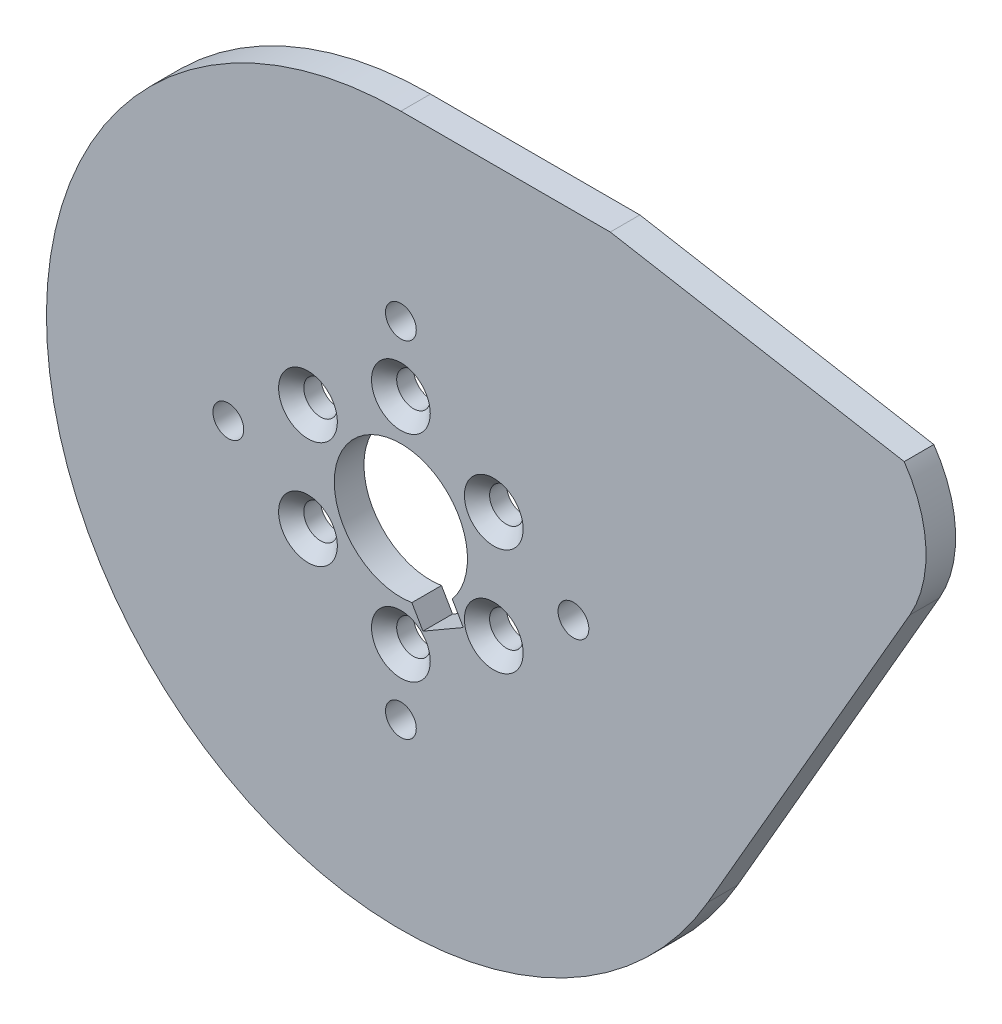
ISO-10303-21;
HEADER;
FILE_DESCRIPTION(('STEP AP214'),'2;1');
FILE_NAME('part.step','',(''),(''),'','','');
FILE_SCHEMA(('AUTOMOTIVE_DESIGN { 1 0 10303 214 1 1 1 1 }'));
ENDSEC;
DATA;
#1=APPLICATION_CONTEXT('core data for automotive mechanical design processes');
#2=APPLICATION_PROTOCOL_DEFINITION('international standard','automotive_design',2000,#1);
#3=PRODUCT_CONTEXT('',#1,'mechanical');
#4=PRODUCT('Part','Part','',(#3));
#5=PRODUCT_RELATED_PRODUCT_CATEGORY('part','',(#4));
#6=PRODUCT_DEFINITION_FORMATION('','',#4);
#7=PRODUCT_DEFINITION_CONTEXT('part definition',#1,'design');
#8=PRODUCT_DEFINITION('design','',#6,#7);
#9=PRODUCT_DEFINITION_SHAPE('','',#8);
#10=(LENGTH_UNIT() NAMED_UNIT(*) SI_UNIT(.MILLI.,.METRE.));
#11=(NAMED_UNIT(*) PLANE_ANGLE_UNIT() SI_UNIT($,.RADIAN.));
#12=(NAMED_UNIT(*) SI_UNIT($,.STERADIAN.) SOLID_ANGLE_UNIT());
#13=UNCERTAINTY_MEASURE_WITH_UNIT(LENGTH_MEASURE(1.E-05),#10,'distance_accuracy_value','');
#14=(GEOMETRIC_REPRESENTATION_CONTEXT(3) GLOBAL_UNCERTAINTY_ASSIGNED_CONTEXT((#13)) GLOBAL_UNIT_ASSIGNED_CONTEXT((#10,
#11,#12)) REPRESENTATION_CONTEXT('',''));
#15=CARTESIAN_POINT('',(0.,0.,0.));
#16=DIRECTION('',(0.,0.,1.));
#17=DIRECTION('',(1.,0.,0.));
#18=AXIS2_PLACEMENT_3D('',#15,#16,#17);
#19=CARTESIAN_POINT('',(43.3012701892193,24.9999999999999,0.));
#20=DIRECTION('',(0.,0.,1.));
#21=DIRECTION('',(1.,0.,0.));
#22=AXIS2_PLACEMENT_3D('',#19,#20,#21);
#23=CYLINDRICAL_SURFACE('',#22,13.0000000000015);
#24=CARTESIAN_POINT('',(43.3012701892193,24.9999999999999,3.175));
#25=DIRECTION('',(0.,0.,1.));
#26=DIRECTION('',(1.,0.,0.));
#27=AXIS2_PLACEMENT_3D('',#24,#25,#26);
#28=CIRCLE('',#27,13.0000000000015);
#29=CARTESIAN_POINT('',(54.5596004384184,18.4999999999993,3.175));
#30=VERTEX_POINT('',#29);
#31=CARTESIAN_POINT('',(53.9595020154318,32.4432583146594,3.175));
#32=VERTEX_POINT('',#31);
#33=EDGE_CURVE('E128',#30,#32,#28,.T.);
#34=ORIENTED_EDGE('',*,*,#33,.F.);
#35=DIRECTION('',(0.,0.,1.));
#36=VECTOR('',#35,1.);
#37=CARTESIAN_POINT('',(54.5596004384184,18.4999999999993,0.));
#38=LINE('',#37,#36);
#39=CARTESIAN_POINT('',(54.5596004384184,18.4999999999993,0.));
#40=VERTEX_POINT('',#39);
#41=EDGE_CURVE('E11',#40,#30,#38,.T.);
#42=ORIENTED_EDGE('',*,*,#41,.F.);
#43=CARTESIAN_POINT('',(43.3012701892193,24.9999999999999,0.));
#44=DIRECTION('',(0.,0.,1.));
#45=DIRECTION('',(1.,0.,0.));
#46=AXIS2_PLACEMENT_3D('',#43,#44,#45);
#47=CIRCLE('',#46,13.0000000000015);
#48=CARTESIAN_POINT('',(53.9595020154318,32.4432583146594,0.));
#49=VERTEX_POINT('',#48);
#50=EDGE_CURVE('E157',#40,#49,#47,.T.);
#51=ORIENTED_EDGE('',*,*,#50,.T.);
#52=DIRECTION('',(0.,0.,1.));
#53=VECTOR('',#52,1.);
#54=CARTESIAN_POINT('',(53.9595020154318,32.4432583146594,0.));
#55=LINE('',#54,#53);
#56=EDGE_CURVE('E41',#49,#32,#55,.T.);
#57=ORIENTED_EDGE('',*,*,#56,.T.);
#58=EDGE_LOOP('',(#34,#42,#51,#57));
#59=FACE_BOUND('',#58,.T.);
#60=ADVANCED_FACE('F38',(#59),#23,.T.);
#61=CARTESIAN_POINT('',(32.9089653438093,-18.9999999999989,0.));
#62=DIRECTION('',(0.866025403784446,-0.499999999999987,0.));
#63=DIRECTION('',(0.499999999999987,0.866025403784446,0.));
#64=AXIS2_PLACEMENT_3D('',#61,#62,#63);
#65=PLANE('',#64);
#66=DIRECTION('',(0.499999999999987,0.866025403784446,0.));
#67=VECTOR('',#66,1.);
#68=CARTESIAN_POINT('',(32.9089653438093,-18.9999999999989,3.175));
#69=LINE('',#68,#67);
#70=CARTESIAN_POINT('',(32.9089653438092,-18.9999999999988,3.175));
#71=VERTEX_POINT('',#70);
#72=EDGE_CURVE('E162',#71,#30,#69,.T.);
#73=ORIENTED_EDGE('',*,*,#72,.F.);
#74=DIRECTION('',(0.,0.,1.));
#75=VECTOR('',#74,1.);
#76=CARTESIAN_POINT('',(32.9089653438092,-18.9999999999988,0.));
#77=LINE('',#76,#75);
#78=CARTESIAN_POINT('',(32.9089653438092,-18.9999999999988,0.));
#79=VERTEX_POINT('',#78);
#80=EDGE_CURVE('E47',#79,#71,#77,.T.);
#81=ORIENTED_EDGE('',*,*,#80,.F.);
#82=DIRECTION('',(0.499999999999987,0.866025403784446,0.));
#83=VECTOR('',#82,1.);
#84=CARTESIAN_POINT('',(32.9089653438093,-18.9999999999989,0.));
#85=LINE('',#84,#83);
#86=EDGE_CURVE('E173',#79,#40,#85,.T.);
#87=ORIENTED_EDGE('',*,*,#86,.T.);
#88=ORIENTED_EDGE('',*,*,#41,.T.);
#89=EDGE_LOOP('',(#73,#81,#87,#88));
#90=FACE_BOUND('',#89,.T.);
#91=ADVANCED_FACE('F217',(#90),#65,.T.);
#92=CARTESIAN_POINT('',(0.,1.23512311489549E-12,0.));
#93=DIRECTION('',(0.,0.,1.));
#94=DIRECTION('',(1.,0.,0.));
#95=AXIS2_PLACEMENT_3D('',#92,#93,#94);
#96=CYLINDRICAL_SURFACE('',#95,38.0000000000004);
#97=CARTESIAN_POINT('',(0.,1.23512311489549E-12,3.175));
#98=DIRECTION('',(0.,0.,1.));
#99=DIRECTION('',(1.,0.,0.));
#100=AXIS2_PLACEMENT_3D('',#97,#98,#99);
#101=CIRCLE('',#100,38.0000000000004);
#102=CARTESIAN_POINT('',(1.4213215752163E-13,38.0000000000016,3.175));
#103=VERTEX_POINT('',#102);
#104=EDGE_CURVE('E188',#103,#71,#101,.T.);
#105=ORIENTED_EDGE('',*,*,#104,.F.);
#106=DIRECTION('',(0.,0.,1.));
#107=VECTOR('',#106,1.);
#108=CARTESIAN_POINT('',(1.4213215752163E-13,38.0000000000016,0.));
#109=LINE('',#108,#107);
#110=CARTESIAN_POINT('',(1.4213215752163E-13,38.0000000000016,0.));
#111=VERTEX_POINT('',#110);
#112=EDGE_CURVE('E197',#111,#103,#109,.T.);
#113=ORIENTED_EDGE('',*,*,#112,.F.);
#114=CARTESIAN_POINT('',(0.,1.23512311489549E-12,0.));
#115=DIRECTION('',(0.,0.,1.));
#116=DIRECTION('',(1.,0.,0.));
#117=AXIS2_PLACEMENT_3D('',#114,#115,#116);
#118=CIRCLE('',#117,38.0000000000004);
#119=EDGE_CURVE('E170',#111,#79,#118,.T.);
#120=ORIENTED_EDGE('',*,*,#119,.T.);
#121=ORIENTED_EDGE('',*,*,#80,.T.);
#122=EDGE_LOOP('',(#105,#113,#120,#121));
#123=FACE_BOUND('',#122,.T.);
#124=ADVANCED_FACE('F224',(#123),#96,.T.);
#125=CARTESIAN_POINT('',(22.4456539190408,38.0000000000013,0.));
#126=DIRECTION('',(0.,1.,0.));
#127=DIRECTION('',(-1.,0.,0.));
#128=AXIS2_PLACEMENT_3D('',#125,#126,#127);
#129=PLANE('',#128);
#130=DIRECTION('',(-1.,0.,0.));
#131=VECTOR('',#130,1.);
#132=CARTESIAN_POINT('',(22.4456539190408,38.0000000000013,3.175));
#133=LINE('',#132,#131);
#134=CARTESIAN_POINT('',(22.4456539190408,38.0000000000013,3.175));
#135=VERTEX_POINT('',#134);
#136=EDGE_CURVE('E184',#135,#103,#133,.T.);
#137=ORIENTED_EDGE('',*,*,#136,.F.);
#138=DIRECTION('',(0.,0.,1.));
#139=VECTOR('',#138,1.);
#140=CARTESIAN_POINT('',(22.4456539190408,38.0000000000013,0.));
#141=LINE('',#140,#139);
#142=CARTESIAN_POINT('',(22.4456539190408,38.0000000000013,0.));
#143=VERTEX_POINT('',#142);
#144=EDGE_CURVE('E199',#143,#135,#141,.T.);
#145=ORIENTED_EDGE('',*,*,#144,.F.);
#146=DIRECTION('',(-1.,0.,0.));
#147=VECTOR('',#146,1.);
#148=CARTESIAN_POINT('',(22.4456539190408,38.0000000000013,0.));
#149=LINE('',#148,#147);
#150=EDGE_CURVE('E166',#143,#111,#149,.T.);
#151=ORIENTED_EDGE('',*,*,#150,.T.);
#152=ORIENTED_EDGE('',*,*,#112,.T.);
#153=EDGE_LOOP('',(#137,#145,#151,#152));
#154=FACE_BOUND('',#153,.T.);
#155=ADVANCED_FACE('F222',(#154),#129,.T.);
#156=CARTESIAN_POINT('',(53.9595020154318,32.4432583146594,0.));
#157=DIRECTION('',(0.173648177666931,0.984807753012208,0.));
#158=DIRECTION('',(-0.984807753012208,0.173648177666931,0.));
#159=AXIS2_PLACEMENT_3D('',#156,#157,#158);
#160=PLANE('',#159);
#161=DIRECTION('',(-0.984807753012208,0.173648177666931,0.));
#162=VECTOR('',#161,1.);
#163=CARTESIAN_POINT('',(53.9595020154318,32.4432583146594,3.175));
#164=LINE('',#163,#162);
#165=EDGE_CURVE('E180',#32,#135,#164,.T.);
#166=ORIENTED_EDGE('',*,*,#165,.F.);
#167=ORIENTED_EDGE('',*,*,#56,.F.);
#168=DIRECTION('',(-0.984807753012208,0.173648177666931,0.));
#169=VECTOR('',#168,1.);
#170=CARTESIAN_POINT('',(53.9595020154318,32.4432583146594,0.));
#171=LINE('',#170,#169);
#172=EDGE_CURVE('E161',#49,#143,#171,.T.);
#173=ORIENTED_EDGE('',*,*,#172,.T.);
#174=ORIENTED_EDGE('',*,*,#144,.T.);
#175=EDGE_LOOP('',(#166,#167,#173,#174));
#176=FACE_BOUND('',#175,.T.);
#177=ADVANCED_FACE('F211',(#176),#160,.T.);
#178=CARTESIAN_POINT('',(43.3012701892193,24.9999999999999,0.));
#179=DIRECTION('',(0.,0.,1.));
#180=DIRECTION('',(1.,0.,0.));
#181=AXIS2_PLACEMENT_3D('',#178,#179,#180);
#182=PLANE('',#181);
#183=CARTESIAN_POINT('',(-9.95929214352075,5.74999999999949,0.));
#184=DIRECTION('',(0.,0.,1.));
#185=DIRECTION('',(1.,0.,0.));
#186=AXIS2_PLACEMENT_3D('',#183,#184,#185);
#187=CIRCLE('',#186,1.8);
#188=CARTESIAN_POINT('',(-8.15929214352075,5.74999999999949,0.));
#189=VERTEX_POINT('',#188);
#190=EDGE_CURVE('E515',#189,#189,#187,.T.);
#191=ORIENTED_EDGE('',*,*,#190,.T.);
#192=EDGE_LOOP('',(#191));
#193=FACE_BOUND('',#192,.T.);
#194=CARTESIAN_POINT('',(-9.95929214352015,-5.75000000000052,0.));
#195=DIRECTION('',(0.,0.,1.));
#196=DIRECTION('',(1.,0.,0.));
#197=AXIS2_PLACEMENT_3D('',#194,#195,#196);
#198=CIRCLE('',#197,1.8);
#199=CARTESIAN_POINT('',(-8.15929214352015,-5.75000000000052,0.));
#200=VERTEX_POINT('',#199);
#201=EDGE_CURVE('E529',#200,#200,#198,.T.);
#202=ORIENTED_EDGE('',*,*,#201,.T.);
#203=EDGE_LOOP('',(#202));
#204=FACE_BOUND('',#203,.T.);
#205=CARTESIAN_POINT('',(1.19132134712707E-12,-11.5,0.));
#206=DIRECTION('',(0.,0.,1.));
#207=DIRECTION('',(1.,0.,0.));
#208=AXIS2_PLACEMENT_3D('',#205,#206,#207);
#209=CIRCLE('',#208,1.8);
#210=CARTESIAN_POINT('',(1.80000000000119,-11.5,0.));
#211=VERTEX_POINT('',#210);
#212=EDGE_CURVE('E540',#211,#211,#209,.T.);
#213=ORIENTED_EDGE('',*,*,#212,.T.);
#214=EDGE_LOOP('',(#213));
#215=FACE_BOUND('',#214,.T.);
#216=CARTESIAN_POINT('',(9.95929214352194,-5.74999999999948,0.));
#217=DIRECTION('',(0.,0.,1.));
#218=DIRECTION('',(1.,0.,0.));
#219=AXIS2_PLACEMENT_3D('',#216,#217,#218);
#220=CIRCLE('',#219,1.8);
#221=CARTESIAN_POINT('',(11.7592921435219,-5.74999999999948,0.));
#222=VERTEX_POINT('',#221);
#223=EDGE_CURVE('E552',#222,#222,#220,.T.);
#224=ORIENTED_EDGE('',*,*,#223,.T.);
#225=EDGE_LOOP('',(#224));
#226=FACE_BOUND('',#225,.T.);
#227=CARTESIAN_POINT('',(9.95929214352134,5.75000000000052,0.));
#228=DIRECTION('',(0.,0.,1.));
#229=DIRECTION('',(1.,0.,0.));
#230=AXIS2_PLACEMENT_3D('',#227,#228,#229);
#231=CIRCLE('',#230,1.8);
#232=CARTESIAN_POINT('',(11.7592921435213,5.75000000000052,0.));
#233=VERTEX_POINT('',#232);
#234=EDGE_CURVE('E564',#233,#233,#231,.T.);
#235=ORIENTED_EDGE('',*,*,#234,.T.);
#236=EDGE_LOOP('',(#235));
#237=FACE_BOUND('',#236,.T.);
#238=CARTESIAN_POINT('',(0.,11.5,0.));
#239=DIRECTION('',(0.,0.,1.));
#240=DIRECTION('',(1.,0.,0.));
#241=AXIS2_PLACEMENT_3D('',#238,#239,#240);
#242=CIRCLE('',#241,1.8);
#243=CARTESIAN_POINT('',(1.8,11.5,0.));
#244=VERTEX_POINT('',#243);
#245=EDGE_CURVE('E575',#244,#244,#242,.T.);
#246=ORIENTED_EDGE('',*,*,#245,.T.);
#247=EDGE_LOOP('',(#246));
#248=FACE_BOUND('',#247,.T.);
#249=CARTESIAN_POINT('',(18.5000000000006,5.80012052705115E-13,0.));
#250=DIRECTION('',(0.,0.,1.));
#251=DIRECTION('',(1.,0.,0.));
#252=AXIS2_PLACEMENT_3D('',#249,#250,#251);
#253=CIRCLE('',#252,1.65);
#254=CARTESIAN_POINT('',(20.1500000000006,5.80012052705115E-13,0.));
#255=VERTEX_POINT('',#254);
#256=EDGE_CURVE('E582',#255,#255,#253,.T.);
#257=ORIENTED_EDGE('',*,*,#256,.T.);
#258=EDGE_LOOP('',(#257));
#259=FACE_BOUND('',#258,.T.);
#260=CARTESIAN_POINT('',(1.16002410541023E-12,-18.5,0.));
#261=DIRECTION('',(0.,0.,1.));
#262=DIRECTION('',(1.,0.,0.));
#263=AXIS2_PLACEMENT_3D('',#260,#261,#262);
#264=CIRCLE('',#263,1.65);
#265=CARTESIAN_POINT('',(1.65000000000116,-18.5,0.));
#266=VERTEX_POINT('',#265);
#267=EDGE_CURVE('E589',#266,#266,#264,.T.);
#268=ORIENTED_EDGE('',*,*,#267,.T.);
#269=EDGE_LOOP('',(#268));
#270=FACE_BOUND('',#269,.T.);
#271=CARTESIAN_POINT('',(-18.4999999999994,-5.82277649283538E-13,0.));
#272=DIRECTION('',(0.,0.,1.));
#273=DIRECTION('',(1.,0.,0.));
#274=AXIS2_PLACEMENT_3D('',#271,#272,#273);
#275=CIRCLE('',#274,1.65);
#276=CARTESIAN_POINT('',(-16.8499999999994,-5.82277649283538E-13,0.));
#277=VERTEX_POINT('',#276);
#278=EDGE_CURVE('E597',#277,#277,#275,.T.);
#279=ORIENTED_EDGE('',*,*,#278,.T.);
#280=EDGE_LOOP('',(#279));
#281=FACE_BOUND('',#280,.T.);
#282=CARTESIAN_POINT('',(0.,18.5,0.));
#283=DIRECTION('',(0.,0.,1.));
#284=DIRECTION('',(1.,0.,0.));
#285=AXIS2_PLACEMENT_3D('',#282,#283,#284);
#286=CIRCLE('',#285,1.65);
#287=CARTESIAN_POINT('',(1.65,18.5,0.));
#288=VERTEX_POINT('',#287);
#289=EDGE_CURVE('E121',#288,#288,#286,.T.);
#290=ORIENTED_EDGE('',*,*,#289,.T.);
#291=EDGE_LOOP('',(#290));
#292=FACE_BOUND('',#291,.T.);
#293=DIRECTION('',(0.500000000000065,-0.866025403784401,0.));
#294=VECTOR('',#293,1.);
#295=CARTESIAN_POINT('',(5.50768518862296,-4.53959057878827,0.));
#296=LINE('',#295,#294);
#297=CARTESIAN_POINT('',(5.50768518862296,-4.53959057878828,0.));
#298=VERTEX_POINT('',#297);
#299=CARTESIAN_POINT('',(6.69431345718396,-6.59489102963305,0.));
#300=VERTEX_POINT('',#299);
#301=EDGE_CURVE('E55',#298,#300,#296,.T.);
#302=ORIENTED_EDGE('',*,*,#301,.F.);
#303=CARTESIAN_POINT('',(0.,0.,0.));
#304=DIRECTION('',(0.,0.,-1.));
#305=DIRECTION('',(-1.,0.,0.));
#306=AXIS2_PLACEMENT_3D('',#303,#304,#305);
#307=CIRCLE('',#306,7.1374);
#308=CARTESIAN_POINT('',(1.17755816970101,-7.03959057878869,0.));
#309=VERTEX_POINT('',#308);
#310=EDGE_CURVE('E111',#309,#298,#307,.T.);
#311=ORIENTED_EDGE('',*,*,#310,.F.);
#312=DIRECTION('',(-0.5,0.866025403784439,0.));
#313=VECTOR('',#312,1.);
#314=CARTESIAN_POINT('',(2.36418643826161,-9.09489102963314,0.));
#315=LINE('',#314,#313);
#316=CARTESIAN_POINT('',(2.36418643826161,-9.09489102963314,0.));
#317=VERTEX_POINT('',#316);
#318=EDGE_CURVE('E140',#317,#309,#315,.T.);
#319=ORIENTED_EDGE('',*,*,#318,.F.);
#320=DIRECTION('',(-0.866025403784439,-0.5,0.));
#321=VECTOR('',#320,1.);
#322=CARTESIAN_POINT('',(6.69431345718396,-6.59489102963305,0.));
#323=LINE('',#322,#321);
#324=EDGE_CURVE('E134',#300,#317,#323,.T.);
#325=ORIENTED_EDGE('',*,*,#324,.F.);
#326=EDGE_LOOP('',(#302,#311,#319,#325));
#327=FACE_BOUND('',#326,.T.);
#328=ORIENTED_EDGE('',*,*,#50,.F.);
#329=ORIENTED_EDGE('',*,*,#86,.F.);
#330=ORIENTED_EDGE('',*,*,#119,.F.);
#331=ORIENTED_EDGE('',*,*,#150,.F.);
#332=ORIENTED_EDGE('',*,*,#172,.F.);
#333=EDGE_LOOP('',(#328,#329,#330,#331,#332));
#334=FACE_BOUND('',#333,.T.);
#335=ADVANCED_FACE('F131',(#193,#204,#215,#226,#237,#248,#259,#270,#281,#292,#327,#334),#182,.F.);
#336=CARTESIAN_POINT('',(43.3012701892193,24.9999999999999,3.175));
#337=DIRECTION('',(0.,0.,1.));
#338=DIRECTION('',(1.,0.,0.));
#339=AXIS2_PLACEMENT_3D('',#336,#337,#338);
#340=PLANE('',#339);
#341=CARTESIAN_POINT('',(-9.95929214352075,5.74999999999949,3.175));
#342=DIRECTION('',(0.,0.,1.));
#343=DIRECTION('',(1.,0.,0.));
#344=AXIS2_PLACEMENT_3D('',#341,#342,#343);
#345=CIRCLE('',#344,3.15);
#346=CARTESIAN_POINT('',(-6.80929214352075,5.74999999999949,3.175));
#347=VERTEX_POINT('',#346);
#348=EDGE_CURVE('E509',#347,#347,#345,.T.);
#349=ORIENTED_EDGE('',*,*,#348,.F.);
#350=EDGE_LOOP('',(#349));
#351=FACE_BOUND('',#350,.T.);
#352=CARTESIAN_POINT('',(-9.95929214352015,-5.75000000000052,3.175));
#353=DIRECTION('',(0.,0.,1.));
#354=DIRECTION('',(1.,0.,0.));
#355=AXIS2_PLACEMENT_3D('',#352,#353,#354);
#356=CIRCLE('',#355,3.15);
#357=CARTESIAN_POINT('',(-6.80929214352015,-5.75000000000052,3.175));
#358=VERTEX_POINT('',#357);
#359=EDGE_CURVE('E521',#358,#358,#356,.T.);
#360=ORIENTED_EDGE('',*,*,#359,.F.);
#361=EDGE_LOOP('',(#360));
#362=FACE_BOUND('',#361,.T.);
#363=CARTESIAN_POINT('',(1.19132134712707E-12,-11.5,3.175));
#364=DIRECTION('',(0.,0.,1.));
#365=DIRECTION('',(1.,0.,0.));
#366=AXIS2_PLACEMENT_3D('',#363,#364,#365);
#367=CIRCLE('',#366,3.15);
#368=CARTESIAN_POINT('',(3.15000000000119,-11.5,3.175));
#369=VERTEX_POINT('',#368);
#370=EDGE_CURVE('E533',#369,#369,#367,.T.);
#371=ORIENTED_EDGE('',*,*,#370,.F.);
#372=EDGE_LOOP('',(#371));
#373=FACE_BOUND('',#372,.T.);
#374=CARTESIAN_POINT('',(9.95929214352194,-5.74999999999948,3.175));
#375=DIRECTION('',(0.,0.,1.));
#376=DIRECTION('',(1.,0.,0.));
#377=AXIS2_PLACEMENT_3D('',#374,#375,#376);
#378=CIRCLE('',#377,3.15);
#379=CARTESIAN_POINT('',(13.1092921435219,-5.74999999999948,3.175));
#380=VERTEX_POINT('',#379);
#381=EDGE_CURVE('E544',#380,#380,#378,.T.);
#382=ORIENTED_EDGE('',*,*,#381,.F.);
#383=EDGE_LOOP('',(#382));
#384=FACE_BOUND('',#383,.T.);
#385=CARTESIAN_POINT('',(9.95929214352134,5.75000000000052,3.175));
#386=DIRECTION('',(0.,0.,1.));
#387=DIRECTION('',(1.,0.,0.));
#388=AXIS2_PLACEMENT_3D('',#385,#386,#387);
#389=CIRCLE('',#388,3.15);
#390=CARTESIAN_POINT('',(13.1092921435213,5.75000000000052,3.175));
#391=VERTEX_POINT('',#390);
#392=EDGE_CURVE('E556',#391,#391,#389,.T.);
#393=ORIENTED_EDGE('',*,*,#392,.F.);
#394=EDGE_LOOP('',(#393));
#395=FACE_BOUND('',#394,.T.);
#396=CARTESIAN_POINT('',(0.,11.5,3.175));
#397=DIRECTION('',(0.,0.,1.));
#398=DIRECTION('',(1.,0.,0.));
#399=AXIS2_PLACEMENT_3D('',#396,#397,#398);
#400=CIRCLE('',#399,3.15);
#401=CARTESIAN_POINT('',(3.15,11.5,3.175));
#402=VERTEX_POINT('',#401);
#403=EDGE_CURVE('E568',#402,#402,#400,.T.);
#404=ORIENTED_EDGE('',*,*,#403,.F.);
#405=EDGE_LOOP('',(#404));
#406=FACE_BOUND('',#405,.T.);
#407=CARTESIAN_POINT('',(18.5000000000006,5.80012052705115E-13,3.175));
#408=DIRECTION('',(0.,0.,1.));
#409=DIRECTION('',(1.,0.,0.));
#410=AXIS2_PLACEMENT_3D('',#407,#408,#409);
#411=CIRCLE('',#410,1.65);
#412=CARTESIAN_POINT('',(20.1500000000006,5.80012052705115E-13,3.175));
#413=VERTEX_POINT('',#412);
#414=EDGE_CURVE('E578',#413,#413,#411,.T.);
#415=ORIENTED_EDGE('',*,*,#414,.F.);
#416=EDGE_LOOP('',(#415));
#417=FACE_BOUND('',#416,.T.);
#418=CARTESIAN_POINT('',(1.16002410541023E-12,-18.5,3.175));
#419=DIRECTION('',(0.,0.,1.));
#420=DIRECTION('',(1.,0.,0.));
#421=AXIS2_PLACEMENT_3D('',#418,#419,#420);
#422=CIRCLE('',#421,1.65);
#423=CARTESIAN_POINT('',(1.65000000000116,-18.5,3.175));
#424=VERTEX_POINT('',#423);
#425=EDGE_CURVE('E586',#424,#424,#422,.T.);
#426=ORIENTED_EDGE('',*,*,#425,.F.);
#427=EDGE_LOOP('',(#426));
#428=FACE_BOUND('',#427,.T.);
#429=CARTESIAN_POINT('',(-18.4999999999994,-5.82277649283538E-13,3.175));
#430=DIRECTION('',(0.,0.,1.));
#431=DIRECTION('',(1.,0.,0.));
#432=AXIS2_PLACEMENT_3D('',#429,#430,#431);
#433=CIRCLE('',#432,1.65);
#434=CARTESIAN_POINT('',(-16.8499999999994,-5.82277649283538E-13,3.175));
#435=VERTEX_POINT('',#434);
#436=EDGE_CURVE('E593',#435,#435,#433,.T.);
#437=ORIENTED_EDGE('',*,*,#436,.F.);
#438=EDGE_LOOP('',(#437));
#439=FACE_BOUND('',#438,.T.);
#440=CARTESIAN_POINT('',(0.,18.5,3.175));
#441=DIRECTION('',(0.,0.,1.));
#442=DIRECTION('',(1.,0.,0.));
#443=AXIS2_PLACEMENT_3D('',#440,#441,#442);
#444=CIRCLE('',#443,1.65);
#445=CARTESIAN_POINT('',(1.65,18.5,3.175));
#446=VERTEX_POINT('',#445);
#447=EDGE_CURVE('E601',#446,#446,#444,.T.);
#448=ORIENTED_EDGE('',*,*,#447,.F.);
#449=EDGE_LOOP('',(#448));
#450=FACE_BOUND('',#449,.T.);
#451=CARTESIAN_POINT('',(0.,0.,3.175));
#452=DIRECTION('',(0.,0.,-1.));
#453=DIRECTION('',(-1.,0.,0.));
#454=AXIS2_PLACEMENT_3D('',#451,#452,#453);
#455=CIRCLE('',#454,7.1374);
#456=CARTESIAN_POINT('',(1.17755816970101,-7.03959057878869,3.175));
#457=VERTEX_POINT('',#456);
#458=CARTESIAN_POINT('',(5.50768518862296,-4.53959057878828,3.175));
#459=VERTEX_POINT('',#458);
#460=EDGE_CURVE('E120',#457,#459,#455,.T.);
#461=ORIENTED_EDGE('',*,*,#460,.T.);
#462=DIRECTION('',(0.500000000000065,-0.866025403784401,0.));
#463=VECTOR('',#462,1.);
#464=CARTESIAN_POINT('',(5.50768518862296,-4.53959057878827,3.175));
#465=LINE('',#464,#463);
#466=CARTESIAN_POINT('',(6.69431345718396,-6.59489102963305,3.175));
#467=VERTEX_POINT('',#466);
#468=EDGE_CURVE('E126',#459,#467,#465,.T.);
#469=ORIENTED_EDGE('',*,*,#468,.T.);
#470=DIRECTION('',(-0.866025403784439,-0.5,0.));
#471=VECTOR('',#470,1.);
#472=CARTESIAN_POINT('',(6.69431345718396,-6.59489102963305,3.175));
#473=LINE('',#472,#471);
#474=CARTESIAN_POINT('',(2.36418643826161,-9.09489102963314,3.175));
#475=VERTEX_POINT('',#474);
#476=EDGE_CURVE('E609',#467,#475,#473,.T.);
#477=ORIENTED_EDGE('',*,*,#476,.T.);
#478=DIRECTION('',(-0.5,0.866025403784439,0.));
#479=VECTOR('',#478,1.);
#480=CARTESIAN_POINT('',(2.36418643826161,-9.09489102963314,3.175));
#481=LINE('',#480,#479);
#482=EDGE_CURVE('E63',#475,#457,#481,.T.);
#483=ORIENTED_EDGE('',*,*,#482,.T.);
#484=EDGE_LOOP('',(#461,#469,#477,#483));
#485=FACE_BOUND('',#484,.T.);
#486=ORIENTED_EDGE('',*,*,#33,.T.);
#487=ORIENTED_EDGE('',*,*,#165,.T.);
#488=ORIENTED_EDGE('',*,*,#136,.T.);
#489=ORIENTED_EDGE('',*,*,#104,.T.);
#490=ORIENTED_EDGE('',*,*,#72,.T.);
#491=EDGE_LOOP('',(#486,#487,#488,#489,#490));
#492=FACE_BOUND('',#491,.T.);
#493=ADVANCED_FACE('F213',(#351,#362,#373,#384,#395,#406,#417,#428,#439,#450,#485,#492),#340,.T.);
#494=CARTESIAN_POINT('',(5.50768518862296,-4.53959057878827,3.175));
#495=DIRECTION('',(0.866025403784401,0.500000000000065,0.));
#496=DIRECTION('',(-0.500000000000065,0.866025403784401,0.));
#497=AXIS2_PLACEMENT_3D('',#494,#495,#496);
#498=PLANE('',#497);
#499=ORIENTED_EDGE('',*,*,#301,.T.);
#500=DIRECTION('',(0.,0.,-1.));
#501=VECTOR('',#500,1.);
#502=CARTESIAN_POINT('',(6.69431345718396,-6.59489102963305,3.175));
#503=LINE('',#502,#501);
#504=EDGE_CURVE('E154',#467,#300,#503,.T.);
#505=ORIENTED_EDGE('',*,*,#504,.F.);
#506=ORIENTED_EDGE('',*,*,#468,.F.);
#507=DIRECTION('',(0.,0.,-1.));
#508=VECTOR('',#507,1.);
#509=CARTESIAN_POINT('',(5.50768518862296,-4.53959057878828,3.175));
#510=LINE('',#509,#508);
#511=EDGE_CURVE('E113',#459,#298,#510,.T.);
#512=ORIENTED_EDGE('',*,*,#511,.T.);
#513=EDGE_LOOP('',(#499,#505,#506,#512));
#514=FACE_BOUND('',#513,.T.);
#515=ADVANCED_FACE('F124',(#514),#498,.F.);
#516=CARTESIAN_POINT('',(2.36418643826161,-9.09489102963314,3.175));
#517=DIRECTION('',(-0.866025403784439,-0.5,0.));
#518=DIRECTION('',(0.5,-0.866025403784439,0.));
#519=AXIS2_PLACEMENT_3D('',#516,#517,#518);
#520=PLANE('',#519);
#521=ORIENTED_EDGE('',*,*,#318,.T.);
#522=DIRECTION('',(0.,0.,-1.));
#523=VECTOR('',#522,1.);
#524=CARTESIAN_POINT('',(1.17755816970101,-7.03959057878869,3.175));
#525=LINE('',#524,#523);
#526=EDGE_CURVE('E115',#457,#309,#525,.T.);
#527=ORIENTED_EDGE('',*,*,#526,.F.);
#528=ORIENTED_EDGE('',*,*,#482,.F.);
#529=DIRECTION('',(0.,0.,-1.));
#530=VECTOR('',#529,1.);
#531=CARTESIAN_POINT('',(2.36418643826161,-9.09489102963314,3.175));
#532=LINE('',#531,#530);
#533=EDGE_CURVE('E151',#475,#317,#532,.T.);
#534=ORIENTED_EDGE('',*,*,#533,.T.);
#535=EDGE_LOOP('',(#521,#527,#528,#534));
#536=FACE_BOUND('',#535,.T.);
#537=ADVANCED_FACE('F279',(#536),#520,.F.);
#538=CARTESIAN_POINT('',(6.69431345718396,-6.59489102963305,3.175));
#539=DIRECTION('',(0.5,-0.866025403784439,0.));
#540=DIRECTION('',(0.866025403784439,0.5,0.));
#541=AXIS2_PLACEMENT_3D('',#538,#539,#540);
#542=PLANE('',#541);
#543=ORIENTED_EDGE('',*,*,#324,.T.);
#544=ORIENTED_EDGE('',*,*,#533,.F.);
#545=ORIENTED_EDGE('',*,*,#476,.F.);
#546=ORIENTED_EDGE('',*,*,#504,.T.);
#547=EDGE_LOOP('',(#543,#544,#545,#546));
#548=FACE_BOUND('',#547,.T.);
#549=ADVANCED_FACE('F287',(#548),#542,.F.);
#550=CARTESIAN_POINT('',(0.,0.,3.175));
#551=DIRECTION('',(0.,0.,-1.));
#552=DIRECTION('',(-1.,0.,0.));
#553=AXIS2_PLACEMENT_3D('',#550,#551,#552);
#554=CYLINDRICAL_SURFACE('',#553,7.1374);
#555=ORIENTED_EDGE('',*,*,#460,.F.);
#556=ORIENTED_EDGE('',*,*,#526,.T.);
#557=ORIENTED_EDGE('',*,*,#310,.T.);
#558=ORIENTED_EDGE('',*,*,#511,.F.);
#559=EDGE_LOOP('',(#555,#556,#557,#558));
#560=FACE_BOUND('',#559,.T.);
#561=ADVANCED_FACE('F112',(#560),#554,.F.);
#562=CARTESIAN_POINT('',(0.,18.5,3.175));
#563=DIRECTION('',(0.,0.,1.));
#564=DIRECTION('',(1.,0.,0.));
#565=AXIS2_PLACEMENT_3D('',#562,#563,#564);
#566=CYLINDRICAL_SURFACE('',#565,1.65);
#567=ORIENTED_EDGE('',*,*,#289,.F.);
#568=EDGE_LOOP('',(#567));
#569=FACE_BOUND('',#568,.T.);
#570=ORIENTED_EDGE('',*,*,#447,.T.);
#571=EDGE_LOOP('',(#570));
#572=FACE_BOUND('',#571,.T.);
#573=ADVANCED_FACE('F302',(#569,#572),#566,.F.);
#574=CARTESIAN_POINT('',(-18.4999999999994,-5.82277649283538E-13,3.175));
#575=DIRECTION('',(0.,0.,1.));
#576=DIRECTION('',(1.,0.,0.));
#577=AXIS2_PLACEMENT_3D('',#574,#575,#576);
#578=CYLINDRICAL_SURFACE('',#577,1.65);
#579=ORIENTED_EDGE('',*,*,#278,.F.);
#580=EDGE_LOOP('',(#579));
#581=FACE_BOUND('',#580,.T.);
#582=ORIENTED_EDGE('',*,*,#436,.T.);
#583=EDGE_LOOP('',(#582));
#584=FACE_BOUND('',#583,.T.);
#585=ADVANCED_FACE('F310',(#581,#584),#578,.F.);
#586=CARTESIAN_POINT('',(1.16002410541023E-12,-18.5,3.175));
#587=DIRECTION('',(0.,0.,1.));
#588=DIRECTION('',(1.,0.,0.));
#589=AXIS2_PLACEMENT_3D('',#586,#587,#588);
#590=CYLINDRICAL_SURFACE('',#589,1.65);
#591=ORIENTED_EDGE('',*,*,#267,.F.);
#592=EDGE_LOOP('',(#591));
#593=FACE_BOUND('',#592,.T.);
#594=ORIENTED_EDGE('',*,*,#425,.T.);
#595=EDGE_LOOP('',(#594));
#596=FACE_BOUND('',#595,.T.);
#597=ADVANCED_FACE('F319',(#593,#596),#590,.F.);
#598=CARTESIAN_POINT('',(18.5000000000006,5.80012052705115E-13,3.175));
#599=DIRECTION('',(0.,0.,1.));
#600=DIRECTION('',(1.,0.,0.));
#601=AXIS2_PLACEMENT_3D('',#598,#599,#600);
#602=CYLINDRICAL_SURFACE('',#601,1.65);
#603=ORIENTED_EDGE('',*,*,#256,.F.);
#604=EDGE_LOOP('',(#603));
#605=FACE_BOUND('',#604,.T.);
#606=ORIENTED_EDGE('',*,*,#414,.T.);
#607=EDGE_LOOP('',(#606));
#608=FACE_BOUND('',#607,.T.);
#609=ADVANCED_FACE('F328',(#605,#608),#602,.F.);
#610=CARTESIAN_POINT('',(0.,11.5,3.175));
#611=DIRECTION('',(0.,0.,1.));
#612=DIRECTION('',(1.,0.,0.));
#613=AXIS2_PLACEMENT_3D('',#610,#611,#612);
#614=CYLINDRICAL_SURFACE('',#613,1.8);
#615=ORIENTED_EDGE('',*,*,#245,.F.);
#616=EDGE_LOOP('',(#615));
#617=FACE_BOUND('',#616,.T.);
#618=CARTESIAN_POINT('',(0.,11.5,1.825));
#619=DIRECTION('',(0.,0.,1.));
#620=DIRECTION('',(1.,0.,0.));
#621=AXIS2_PLACEMENT_3D('',#618,#619,#620);
#622=CIRCLE('',#621,1.8);
#623=CARTESIAN_POINT('',(1.8,11.5,1.825));
#624=VERTEX_POINT('',#623);
#625=EDGE_CURVE('E571',#624,#624,#622,.T.);
#626=ORIENTED_EDGE('',*,*,#625,.T.);
#627=EDGE_LOOP('',(#626));
#628=FACE_BOUND('',#627,.T.);
#629=ADVANCED_FACE('F336',(#617,#628),#614,.F.);
#630=CARTESIAN_POINT('',(0.,11.5,3.175));
#631=DIRECTION('',(0.,0.,1.));
#632=DIRECTION('',(1.,0.,0.));
#633=AXIS2_PLACEMENT_3D('',#630,#631,#632);
#634=CONICAL_SURFACE('',#633,3.15,0.785398163397449);
#635=ORIENTED_EDGE('',*,*,#625,.F.);
#636=EDGE_LOOP('',(#635));
#637=FACE_BOUND('',#636,.T.);
#638=ORIENTED_EDGE('',*,*,#403,.T.);
#639=EDGE_LOOP('',(#638));
#640=FACE_BOUND('',#639,.T.);
#641=ADVANCED_FACE('F344',(#637,#640),#634,.F.);
#642=CARTESIAN_POINT('',(9.95929214352134,5.75000000000052,3.175));
#643=DIRECTION('',(0.,0.,1.));
#644=DIRECTION('',(1.,0.,0.));
#645=AXIS2_PLACEMENT_3D('',#642,#643,#644);
#646=CYLINDRICAL_SURFACE('',#645,1.8);
#647=ORIENTED_EDGE('',*,*,#234,.F.);
#648=EDGE_LOOP('',(#647));
#649=FACE_BOUND('',#648,.T.);
#650=CARTESIAN_POINT('',(9.95929214352134,5.75000000000052,1.825));
#651=DIRECTION('',(0.,0.,1.));
#652=DIRECTION('',(1.,0.,0.));
#653=AXIS2_PLACEMENT_3D('',#650,#651,#652);
#654=CIRCLE('',#653,1.8);
#655=CARTESIAN_POINT('',(11.7592921435213,5.75000000000052,1.825));
#656=VERTEX_POINT('',#655);
#657=EDGE_CURVE('E560',#656,#656,#654,.T.);
#658=ORIENTED_EDGE('',*,*,#657,.T.);
#659=EDGE_LOOP('',(#658));
#660=FACE_BOUND('',#659,.T.);
#661=ADVANCED_FACE('F353',(#649,#660),#646,.F.);
#662=CARTESIAN_POINT('',(9.95929214352134,5.75000000000052,3.175));
#663=DIRECTION('',(0.,0.,1.));
#664=DIRECTION('',(1.,0.,0.));
#665=AXIS2_PLACEMENT_3D('',#662,#663,#664);
#666=CONICAL_SURFACE('',#665,3.15,0.785398163397449);
#667=ORIENTED_EDGE('',*,*,#657,.F.);
#668=EDGE_LOOP('',(#667));
#669=FACE_BOUND('',#668,.T.);
#670=ORIENTED_EDGE('',*,*,#392,.T.);
#671=EDGE_LOOP('',(#670));
#672=FACE_BOUND('',#671,.T.);
#673=ADVANCED_FACE('F362',(#669,#672),#666,.F.);
#674=CARTESIAN_POINT('',(9.95929214352194,-5.74999999999948,3.175));
#675=DIRECTION('',(0.,0.,1.));
#676=DIRECTION('',(1.,0.,0.));
#677=AXIS2_PLACEMENT_3D('',#674,#675,#676);
#678=CYLINDRICAL_SURFACE('',#677,1.8);
#679=ORIENTED_EDGE('',*,*,#223,.F.);
#680=EDGE_LOOP('',(#679));
#681=FACE_BOUND('',#680,.T.);
#682=CARTESIAN_POINT('',(9.95929214352194,-5.74999999999948,1.825));
#683=DIRECTION('',(0.,0.,1.));
#684=DIRECTION('',(1.,0.,0.));
#685=AXIS2_PLACEMENT_3D('',#682,#683,#684);
#686=CIRCLE('',#685,1.8);
#687=CARTESIAN_POINT('',(11.7592921435219,-5.74999999999948,1.825));
#688=VERTEX_POINT('',#687);
#689=EDGE_CURVE('E548',#688,#688,#686,.T.);
#690=ORIENTED_EDGE('',*,*,#689,.T.);
#691=EDGE_LOOP('',(#690));
#692=FACE_BOUND('',#691,.T.);
#693=ADVANCED_FACE('F371',(#681,#692),#678,.F.);
#694=CARTESIAN_POINT('',(9.95929214352194,-5.74999999999948,3.175));
#695=DIRECTION('',(0.,0.,1.));
#696=DIRECTION('',(1.,0.,0.));
#697=AXIS2_PLACEMENT_3D('',#694,#695,#696);
#698=CONICAL_SURFACE('',#697,3.15,0.785398163397449);
#699=ORIENTED_EDGE('',*,*,#689,.F.);
#700=EDGE_LOOP('',(#699));
#701=FACE_BOUND('',#700,.T.);
#702=ORIENTED_EDGE('',*,*,#381,.T.);
#703=EDGE_LOOP('',(#702));
#704=FACE_BOUND('',#703,.T.);
#705=ADVANCED_FACE('F380',(#701,#704),#698,.F.);
#706=CARTESIAN_POINT('',(1.19132134712707E-12,-11.5,3.175));
#707=DIRECTION('',(0.,0.,1.));
#708=DIRECTION('',(1.,0.,0.));
#709=AXIS2_PLACEMENT_3D('',#706,#707,#708);
#710=CYLINDRICAL_SURFACE('',#709,1.8);
#711=ORIENTED_EDGE('',*,*,#212,.F.);
#712=EDGE_LOOP('',(#711));
#713=FACE_BOUND('',#712,.T.);
#714=CARTESIAN_POINT('',(1.19132134712707E-12,-11.5,1.825));
#715=DIRECTION('',(0.,0.,1.));
#716=DIRECTION('',(1.,0.,0.));
#717=AXIS2_PLACEMENT_3D('',#714,#715,#716);
#718=CIRCLE('',#717,1.8);
#719=CARTESIAN_POINT('',(1.80000000000119,-11.5,1.825));
#720=VERTEX_POINT('',#719);
#721=EDGE_CURVE('E536',#720,#720,#718,.T.);
#722=ORIENTED_EDGE('',*,*,#721,.T.);
#723=EDGE_LOOP('',(#722));
#724=FACE_BOUND('',#723,.T.);
#725=ADVANCED_FACE('F389',(#713,#724),#710,.F.);
#726=CARTESIAN_POINT('',(1.19132134712707E-12,-11.5,3.175));
#727=DIRECTION('',(0.,0.,1.));
#728=DIRECTION('',(1.,0.,0.));
#729=AXIS2_PLACEMENT_3D('',#726,#727,#728);
#730=CONICAL_SURFACE('',#729,3.15,0.785398163397449);
#731=ORIENTED_EDGE('',*,*,#721,.F.);
#732=EDGE_LOOP('',(#731));
#733=FACE_BOUND('',#732,.T.);
#734=ORIENTED_EDGE('',*,*,#370,.T.);
#735=EDGE_LOOP('',(#734));
#736=FACE_BOUND('',#735,.T.);
#737=ADVANCED_FACE('F398',(#733,#736),#730,.F.);
#738=CARTESIAN_POINT('',(-9.95929214352015,-5.75000000000052,3.175));
#739=DIRECTION('',(0.,0.,1.));
#740=DIRECTION('',(1.,0.,0.));
#741=AXIS2_PLACEMENT_3D('',#738,#739,#740);
#742=CYLINDRICAL_SURFACE('',#741,1.8);
#743=ORIENTED_EDGE('',*,*,#201,.F.);
#744=EDGE_LOOP('',(#743));
#745=FACE_BOUND('',#744,.T.);
#746=CARTESIAN_POINT('',(-9.95929214352015,-5.75000000000052,1.825));
#747=DIRECTION('',(0.,0.,1.));
#748=DIRECTION('',(1.,0.,0.));
#749=AXIS2_PLACEMENT_3D('',#746,#747,#748);
#750=CIRCLE('',#749,1.8);
#751=CARTESIAN_POINT('',(-8.15929214352015,-5.75000000000052,1.825));
#752=VERTEX_POINT('',#751);
#753=EDGE_CURVE('E525',#752,#752,#750,.T.);
#754=ORIENTED_EDGE('',*,*,#753,.T.);
#755=EDGE_LOOP('',(#754));
#756=FACE_BOUND('',#755,.T.);
#757=ADVANCED_FACE('F407',(#745,#756),#742,.F.);
#758=CARTESIAN_POINT('',(-9.95929214352015,-5.75000000000052,3.175));
#759=DIRECTION('',(0.,0.,1.));
#760=DIRECTION('',(1.,0.,0.));
#761=AXIS2_PLACEMENT_3D('',#758,#759,#760);
#762=CONICAL_SURFACE('',#761,3.15,0.785398163397449);
#763=ORIENTED_EDGE('',*,*,#753,.F.);
#764=EDGE_LOOP('',(#763));
#765=FACE_BOUND('',#764,.T.);
#766=ORIENTED_EDGE('',*,*,#359,.T.);
#767=EDGE_LOOP('',(#766));
#768=FACE_BOUND('',#767,.T.);
#769=ADVANCED_FACE('F416',(#765,#768),#762,.F.);
#770=CARTESIAN_POINT('',(-9.95929214352075,5.74999999999949,3.175));
#771=DIRECTION('',(0.,0.,1.));
#772=DIRECTION('',(1.,0.,0.));
#773=AXIS2_PLACEMENT_3D('',#770,#771,#772);
#774=CYLINDRICAL_SURFACE('',#773,1.8);
#775=ORIENTED_EDGE('',*,*,#190,.F.);
#776=EDGE_LOOP('',(#775));
#777=FACE_BOUND('',#776,.T.);
#778=CARTESIAN_POINT('',(-9.95929214352075,5.74999999999949,1.825));
#779=DIRECTION('',(0.,0.,1.));
#780=DIRECTION('',(1.,0.,0.));
#781=AXIS2_PLACEMENT_3D('',#778,#779,#780);
#782=CIRCLE('',#781,1.8);
#783=CARTESIAN_POINT('',(-8.15929214352075,5.74999999999949,1.825));
#784=VERTEX_POINT('',#783);
#785=EDGE_CURVE('E506',#784,#784,#782,.T.);
#786=ORIENTED_EDGE('',*,*,#785,.T.);
#787=EDGE_LOOP('',(#786));
#788=FACE_BOUND('',#787,.T.);
#789=ADVANCED_FACE('F425',(#777,#788),#774,.F.);
#790=CARTESIAN_POINT('',(-9.95929214352075,5.74999999999949,3.175));
#791=DIRECTION('',(0.,0.,1.));
#792=DIRECTION('',(1.,0.,0.));
#793=AXIS2_PLACEMENT_3D('',#790,#791,#792);
#794=CONICAL_SURFACE('',#793,3.15,0.785398163397449);
#795=ORIENTED_EDGE('',*,*,#785,.F.);
#796=EDGE_LOOP('',(#795));
#797=FACE_BOUND('',#796,.T.);
#798=ORIENTED_EDGE('',*,*,#348,.T.);
#799=EDGE_LOOP('',(#798));
#800=FACE_BOUND('',#799,.T.);
#801=ADVANCED_FACE('F434',(#797,#800),#794,.F.);
#802=CLOSED_SHELL('',(#60,#91,#124,#155,#177,#335,#493,#515,#537,#549,#561,#573,#585,#597,#609,
#629,#641,#661,#673,#693,#705,#725,#737,#757,#769,#789,#801));
#803=MANIFOLD_SOLID_BREP('B2',#802);
#804=ADVANCED_BREP_SHAPE_REPRESENTATION('',(#18,#803),#14);
#805=SHAPE_DEFINITION_REPRESENTATION(#9,#804);
ENDSEC;
END-ISO-10303-21;
